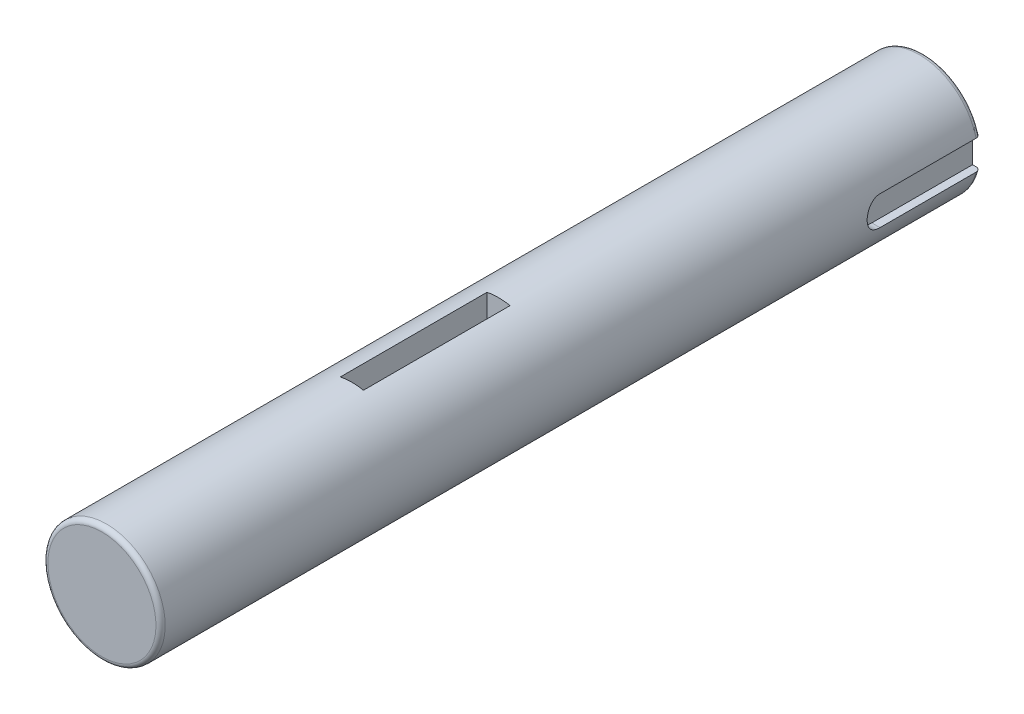
ISO-10303-21;
HEADER;
FILE_DESCRIPTION(('STEP AP214'),'2;1');
FILE_NAME('part.step','',(''),(''),'','','');
FILE_SCHEMA(('AUTOMOTIVE_DESIGN { 1 0 10303 214 1 1 1 1 }'));
ENDSEC;
DATA;
#1=APPLICATION_CONTEXT('core data for automotive mechanical design processes');
#2=APPLICATION_PROTOCOL_DEFINITION('international standard','automotive_design',2000,#1);
#3=PRODUCT_CONTEXT('',#1,'mechanical');
#4=PRODUCT('Part','Part','',(#3));
#5=PRODUCT_RELATED_PRODUCT_CATEGORY('part','',(#4));
#6=PRODUCT_DEFINITION_FORMATION('','',#4);
#7=PRODUCT_DEFINITION_CONTEXT('part definition',#1,'design');
#8=PRODUCT_DEFINITION('design','',#6,#7);
#9=PRODUCT_DEFINITION_SHAPE('','',#8);
#10=(LENGTH_UNIT() NAMED_UNIT(*) SI_UNIT(.MILLI.,.METRE.));
#11=(NAMED_UNIT(*) PLANE_ANGLE_UNIT() SI_UNIT($,.RADIAN.));
#12=(NAMED_UNIT(*) SI_UNIT($,.STERADIAN.) SOLID_ANGLE_UNIT());
#13=UNCERTAINTY_MEASURE_WITH_UNIT(LENGTH_MEASURE(1.E-05),#10,'distance_accuracy_value','');
#14=(GEOMETRIC_REPRESENTATION_CONTEXT(3) GLOBAL_UNCERTAINTY_ASSIGNED_CONTEXT((#13)) GLOBAL_UNIT_ASSIGNED_CONTEXT((#10,
#11,#12)) REPRESENTATION_CONTEXT('',''));
#15=CARTESIAN_POINT('',(0.,0.,0.));
#16=DIRECTION('',(0.,0.,1.));
#17=DIRECTION('',(1.,0.,0.));
#18=AXIS2_PLACEMENT_3D('',#15,#16,#17);
#19=CARTESIAN_POINT('',(0.,0.,0.));
#20=DIRECTION('',(0.,0.,-1.));
#21=DIRECTION('',(0.,1.,0.));
#22=AXIS2_PLACEMENT_3D('',#19,#20,#21);
#23=PLANE('',#22);
#24=DIRECTION('',(1.,0.,0.));
#25=VECTOR('',#24,1.);
#26=CARTESIAN_POINT('',(21.05,-6.35,0.));
#27=LINE('',#26,#25);
#28=CARTESIAN_POINT('',(21.05,-6.35,0.));
#29=VERTEX_POINT('',#28);
#30=CARTESIAN_POINT('',(22.5219337535846,-6.35,0.));
#31=VERTEX_POINT('',#30);
#32=EDGE_CURVE('E149',#29,#31,#27,.T.);
#33=ORIENTED_EDGE('',*,*,#32,.T.);
#34=CARTESIAN_POINT('',(0.,0.,0.));
#35=DIRECTION('',(0.,0.,-1.));
#36=DIRECTION('',(0.,1.,0.));
#37=AXIS2_PLACEMENT_3D('',#34,#35,#36);
#38=CIRCLE('',#37,23.4);
#39=CARTESIAN_POINT('',(22.5219337535657,6.35,0.));
#40=VERTEX_POINT('',#39);
#41=EDGE_CURVE('E195',#31,#40,#38,.T.);
#42=ORIENTED_EDGE('',*,*,#41,.T.);
#43=DIRECTION('',(1.,0.,0.));
#44=VECTOR('',#43,1.);
#45=CARTESIAN_POINT('',(21.05,6.35,0.));
#46=LINE('',#45,#44);
#47=CARTESIAN_POINT('',(21.05,6.35,0.));
#48=VERTEX_POINT('',#47);
#49=EDGE_CURVE('E148',#48,#40,#46,.T.);
#50=ORIENTED_EDGE('',*,*,#49,.F.);
#51=DIRECTION('',(0.,1.,0.));
#52=VECTOR('',#51,1.);
#53=CARTESIAN_POINT('',(21.05,6.35,0.));
#54=LINE('',#53,#52);
#55=EDGE_CURVE('E135',#29,#48,#54,.T.);
#56=ORIENTED_EDGE('',*,*,#55,.F.);
#57=EDGE_LOOP('',(#33,#42,#50,#56));
#58=FACE_BOUND('',#57,.T.);
#59=ADVANCED_FACE('F34',(#58),#23,.T.);
#60=CARTESIAN_POINT('',(0.,0.,2.));
#61=DIRECTION('',(0.,0.,-1.));
#62=DIRECTION('',(0.,1.,0.));
#63=AXIS2_PLACEMENT_3D('',#60,#61,#62);
#64=TOROIDAL_SURFACE('',#63,23.4000000000001,2.);
#65=CARTESIAN_POINT('',(21.4660827730526,-6.35,0.276341628928589));
#66=CARTESIAN_POINT('',(21.3657190871375,-6.35,0.332985201502739));
#67=CARTESIAN_POINT('',(21.2699361555777,-6.35,0.397883089300217));
#68=CARTESIAN_POINT('',(21.0903923768844,-6.35,0.542726515744946));
#69=CARTESIAN_POINT('',(21.0066419857732,-6.35,0.622685003979037));
#70=CARTESIAN_POINT('',(20.853793271713,-6.35,0.795793697997615));
#71=CARTESIAN_POINT('',(20.7847151116909,-6.35,0.88896176743119));
#72=CARTESIAN_POINT('',(20.6638075830707,-6.35,1.08587586156095));
#73=CARTESIAN_POINT('',(20.6119723312019,-6.35,1.18961826248516));
#74=CARTESIAN_POINT('',(20.528833603456,-6.35,1.40124195470699));
#75=CARTESIAN_POINT('',(20.4969317895799,-6.35,1.50888806094866));
#76=CARTESIAN_POINT('',(20.4523384870174,-6.35,1.72808700588808));
#77=CARTESIAN_POINT('',(20.4396434577715,-6.35,1.83963912067606));
#78=CARTESIAN_POINT('',(20.4340467022498,-6.35,2.05958465654632));
#79=CARTESIAN_POINT('',(20.4405132416019,-6.35,2.16796250562678));
#80=CARTESIAN_POINT('',(20.471636046302,-6.35,2.38206446982306));
#81=CARTESIAN_POINT('',(20.4962912345292,-6.35,2.48778874169876));
#82=CARTESIAN_POINT('',(20.5627674762637,-6.35,2.69322349061848));
#83=CARTESIAN_POINT('',(20.6045214542427,-6.35,2.79295573972768));
#84=CARTESIAN_POINT('',(20.7037679935274,-6.35,2.9842434446737));
#85=CARTESIAN_POINT('',(20.7612621468403,-6.35,3.07579807215912));
#86=CARTESIAN_POINT('',(20.8918551491658,-6.35,3.2507533346549));
#87=CARTESIAN_POINT('',(20.9653217124337,-6.35,3.33387919562343));
#88=CARTESIAN_POINT('',(21.1246651736042,-6.35,3.4872256859756));
#89=CARTESIAN_POINT('',(21.2105444564782,-6.35,3.55744382937561));
#90=CARTESIAN_POINT('',(21.3960796054276,-6.35,3.68606606290128));
#91=CARTESIAN_POINT('',(21.4961593677836,-6.35,3.74385874109108));
#92=CARTESIAN_POINT('',(21.7043407983787,-6.35,3.84251532850828));
#93=CARTESIAN_POINT('',(21.8124440530085,-6.35,3.88337587937568));
#94=CARTESIAN_POINT('',(22.0378762132366,-6.35,3.94846500203193));
#95=CARTESIAN_POINT('',(22.1553982344222,-6.35,3.97202603671922));
#96=CARTESIAN_POINT('',(22.3927256337619,-6.35,3.99943749694812));
#97=CARTESIAN_POINT('',(22.5125312892844,-6.35,4.00328551265335));
#98=CARTESIAN_POINT('',(22.7530756122925,-6.35,3.99101534652746));
#99=CARTESIAN_POINT('',(22.8737979805774,-6.35,3.9745728919217));
#100=CARTESIAN_POINT('',(23.1107202385136,-6.35,3.92146328757417));
#101=CARTESIAN_POINT('',(23.2269201913182,-6.35,3.88479642036484));
#102=CARTESIAN_POINT('',(23.4502431062685,-6.35,3.7924858577057));
#103=CARTESIAN_POINT('',(23.5574417721367,-6.35,3.73702563491983));
#104=CARTESIAN_POINT('',(23.760635685377,-6.35,3.60839019596958));
#105=CARTESIAN_POINT('',(23.8566325682802,-6.35,3.53521757073644));
#106=CARTESIAN_POINT('',(24.0317131401887,-6.35,3.37542153623586));
#107=CARTESIAN_POINT('',(24.1112012033014,-6.35,3.28924140419281));
#108=CARTESIAN_POINT('',(24.2539640930054,-6.35,3.10435605683604));
#109=CARTESIAN_POINT('',(24.3172422144524,-6.35,3.00565339297851));
#110=CARTESIAN_POINT('',(24.4235345261517,-6.35,2.80214186835381));
#111=CARTESIAN_POINT('',(24.4671637874498,-6.35,2.69765411408891));
#112=CARTESIAN_POINT('',(24.5357355230922,-6.35,2.48271790604074));
#113=CARTESIAN_POINT('',(24.5606811154363,-6.35,2.37227045013412));
#114=CARTESIAN_POINT('',(24.5906245926256,-6.35,2.15159794820088));
#115=CARTESIAN_POINT('',(24.5961177176307,-6.35,2.04143986139854));
#116=CARTESIAN_POINT('',(24.5883551814952,-6.35,1.82179157216518));
#117=CARTESIAN_POINT('',(24.5751009433796,-6.35,1.71230131967553));
#118=CARTESIAN_POINT('',(24.5304863344191,-6.35,1.49806036403073));
#119=CARTESIAN_POINT('',(24.4992814854266,-6.35,1.39327718156559));
#120=CARTESIAN_POINT('',(24.419904771508,-6.35,1.1903557558015));
#121=CARTESIAN_POINT('',(24.3717324212458,-6.35,1.09221770267466));
#122=CARTESIAN_POINT('',(24.2593350082909,-6.35,0.90418193614259));
#123=CARTESIAN_POINT('',(24.1949428637423,-6.35,0.814384204068524));
#124=CARTESIAN_POINT('',(24.052353013183,-6.35,0.646525804250856));
#125=CARTESIAN_POINT('',(23.974153735134,-6.35,0.568466474882173));
#126=CARTESIAN_POINT('',(23.8040191628536,-6.35,0.424074891899811));
#127=CARTESIAN_POINT('',(23.7117773387769,-6.35,0.358104004852536));
#128=CARTESIAN_POINT('',(23.5178206959817,-6.35,0.242006831078214));
#129=CARTESIAN_POINT('',(23.4161047302198,-6.35,0.191882466141398));
#130=CARTESIAN_POINT('',(23.2024971806971,-6.35,0.107157512275249));
#131=CARTESIAN_POINT('',(23.0903804318179,-6.35,0.0731245471800341));
#132=CARTESIAN_POINT('',(22.8620700239232,-6.35,0.0237801020119275));
#133=CARTESIAN_POINT('',(22.7458747714312,-6.35,0.00847602500880295));
#134=CARTESIAN_POINT('',(22.5091883099231,-6.35,-0.00330736512227577));
#135=CARTESIAN_POINT('',(22.3886695837694,-6.35,0.000766761527939125));
#136=CARTESIAN_POINT('',(22.1500664063449,-6.35,0.0288643264058206));
#137=CARTESIAN_POINT('',(22.0319796313091,-6.35,0.0528677201493369));
#138=CARTESIAN_POINT('',(21.8383483299907,-6.35,0.109414371901366));
#139=CARTESIAN_POINT('',(21.7612548210788,-6.35,0.136786902411852));
#140=CARTESIAN_POINT('',(21.6107009268289,-6.35,0.200170433898773));
#141=CARTESIAN_POINT('',(21.5372405241582,-6.35,0.236181393658159));
#142=CARTESIAN_POINT('',(21.4660827730526,-6.35,0.276341628928589));
#143=B_SPLINE_CURVE_WITH_KNOTS('',3,(#65,#66,#67,#68,#69,#70,#71,#72,#73,#74,#75,#76,#77,#78,
#79,#80,#81,#82,#83,#84,#85,#86,#87,#88,#89,#90,#91,#92,#93,#94,#95,#96,#97,#98,#99,#100,#101,
#102,#103,#104,#105,#106,#107,#108,#109,#110,#111,#112,#113,#114,#115,#116,#117,#118,#119,#120,
#121,#122,#123,#124,#125,#126,#127,#128,#129,#130,#131,#132,#133,#134,#135,#136,#137,#138,#139,
#140,#141,#142),.UNSPECIFIED.,.T.,.F.,(4,2,2,2,2,2,2,2,2,2,2,2,2,2,2,2,2,2,2,2,2,2,2,2,2,2,2,2,
2,2,2,2,2,2,2,2,2,2,4),(0.,0.345451613804507,0.691201625234868,1.03742374361034,
1.38352760973308,1.71866862397346,2.05374785112197,2.37790412329771,2.70204120067869,
3.02491874378853,3.34782895574487,3.67915680802435,4.01054840624442,4.35569642843138,
4.70091287540151,5.05883584127049,5.41680256072195,5.78056496465215,6.14432228699731,
6.50462606680503,6.86487717398441,7.2148509976872,7.56475362866626,7.90277607694787,
8.24074210221678,8.57003941246915,8.89931172864002,9.22577333759667,9.55224428537423,
9.88222658104576,10.2122464717575,10.5509240261556,10.8896426380019,11.2395525205681,
11.5896006692953,11.9497052062088,12.3094479948424,12.5543740058358,12.7992988482224),.UNSPECIFIED.);
#144=CARTESIAN_POINT('',(24.5934442484171,-6.35,2.));
#145=VERTEX_POINT('',#144);
#146=EDGE_CURVE('E163',#145,#31,#143,.T.);
#147=ORIENTED_EDGE('',*,*,#146,.F.);
#148=CARTESIAN_POINT('',(0.,0.,2.));
#149=DIRECTION('',(0.,0.,-1.));
#150=DIRECTION('',(0.,1.,0.));
#151=AXIS2_PLACEMENT_3D('',#148,#149,#150);
#152=CIRCLE('',#151,25.4000000000001);
#153=CARTESIAN_POINT('',(24.5934442484172,6.35,2.));
#154=VERTEX_POINT('',#153);
#155=EDGE_CURVE('E205',#145,#154,#152,.T.);
#156=ORIENTED_EDGE('',*,*,#155,.T.);
#157=CARTESIAN_POINT('',(21.4660827730526,6.35,0.276341628928589));
#158=CARTESIAN_POINT('',(21.5710842555623,6.35,0.217091085900893));
#159=CARTESIAN_POINT('',(21.6812560128715,6.35,0.166789983188979));
#160=CARTESIAN_POINT('',(21.908597867135,6.35,0.0853669639085896));
#161=CARTESIAN_POINT('',(22.0257789034783,6.35,0.0542759329057522));
#162=CARTESIAN_POINT('',(22.2635733646172,6.35,0.0121137284896716));
#163=CARTESIAN_POINT('',(22.3841830757241,6.35,0.00102167436584336));
#164=CARTESIAN_POINT('',(22.6255222272109,6.35,-0.000886540404961683));
#165=CARTESIAN_POINT('',(22.7462516146839,6.35,0.00829058251994164));
#166=CARTESIAN_POINT('',(22.9851606106335,6.35,0.0468889799237799));
#167=CARTESIAN_POINT('',(23.1033214384654,6.35,0.0764270077282673));
#168=CARTESIAN_POINT('',(23.3328793391199,6.35,0.155258982537404));
#169=CARTESIAN_POINT('',(23.4442763774859,6.35,0.204553030175012));
#170=CARTESIAN_POINT('',(23.6550451049705,6.35,0.320737310643597));
#171=CARTESIAN_POINT('',(23.7545879858434,6.35,0.387316603142431));
#172=CARTESIAN_POINT('',(23.9406051001662,6.35,0.53675478409388));
#173=CARTESIAN_POINT('',(24.0270816941892,6.35,0.619610725748738));
#174=CARTESIAN_POINT('',(24.1815321681423,6.35,0.796433755330171));
#175=CARTESIAN_POINT('',(24.250008354211,6.35,0.889961995513799));
#176=CARTESIAN_POINT('',(24.3696599911094,6.35,1.08750062657604));
#177=CARTESIAN_POINT('',(24.4208389444711,6.35,1.19150888980164));
#178=CARTESIAN_POINT('',(24.5027366157631,6.35,1.40339124441844));
#179=CARTESIAN_POINT('',(24.5340680296882,6.35,1.51102872221333));
#180=CARTESIAN_POINT('',(24.5777855259891,6.35,1.73008224728945));
#181=CARTESIAN_POINT('',(24.5901742578679,6.35,1.84149776390961));
#182=CARTESIAN_POINT('',(24.5955241316361,6.35,2.06246864559837));
#183=CARTESIAN_POINT('',(24.5888834406565,6.35,2.172014582079));
#184=CARTESIAN_POINT('',(24.5572547830059,6.35,2.388418610064));
#185=CARTESIAN_POINT('',(24.5322675832755,6.35,2.49527681373075));
#186=CARTESIAN_POINT('',(24.4648499201159,6.35,2.70306701386404));
#187=CARTESIAN_POINT('',(24.4224584081901,6.35,2.80401167226216));
#188=CARTESIAN_POINT('',(24.321593898498,6.35,2.99750935318419));
#189=CARTESIAN_POINT('',(24.2631199750951,6.35,3.09006189228492));
#190=CARTESIAN_POINT('',(24.1308051899835,6.35,3.26583290025107));
#191=CARTESIAN_POINT('',(24.0567277021389,6.35,3.34887308876995));
#192=CARTESIAN_POINT('',(23.8960428780766,6.35,3.50177525540593));
#193=CARTESIAN_POINT('',(23.8094339036878,6.35,3.57163550782864));
#194=CARTESIAN_POINT('',(23.6234334600127,6.35,3.69842243819878));
#195=CARTESIAN_POINT('',(23.5237397036543,6.35,3.75490550032186));
#196=CARTESIAN_POINT('',(23.3165123083763,6.35,3.85094635649154));
#197=CARTESIAN_POINT('',(23.2089773663779,6.35,3.89050132982525));
#198=CARTESIAN_POINT('',(22.9853320066497,6.35,3.9528965326283));
#199=CARTESIAN_POINT('',(22.8690557568413,6.35,3.97514279214383));
#200=CARTESIAN_POINT('',(22.6344271548724,6.35,4.00030237006931));
#201=CARTESIAN_POINT('',(22.5160744892845,6.35,4.00321274418253));
#202=CARTESIAN_POINT('',(22.2776469246073,6.35,3.98953892943707));
#203=CARTESIAN_POINT('',(22.1575986269632,6.35,3.97248636771173));
#204=CARTESIAN_POINT('',(21.9220332639296,6.35,3.9185419560001));
#205=CARTESIAN_POINT('',(21.806516519029,6.35,3.88164870550791));
#206=CARTESIAN_POINT('',(21.5830228088632,6.35,3.78875053476855));
#207=CARTESIAN_POINT('',(21.4750691275931,6.35,3.73268947260229));
#208=CARTESIAN_POINT('',(21.2704010991088,6.35,3.60282621644632));
#209=CARTESIAN_POINT('',(21.1736856921885,6.35,3.52902569720499));
#210=CARTESIAN_POINT('',(20.9968082572405,6.35,3.36749998174988));
#211=CARTESIAN_POINT('',(20.916310669014,6.35,3.28014272380628));
#212=CARTESIAN_POINT('',(20.7718957832662,6.35,3.09264757938249));
#213=CARTESIAN_POINT('',(20.7079742068274,6.35,2.99251300120709));
#214=CARTESIAN_POINT('',(20.601404493887,6.35,2.78679066656835));
#215=CARTESIAN_POINT('',(20.5579790378762,6.35,2.68160561777895));
#216=CARTESIAN_POINT('',(20.4902085815663,6.35,2.46526046068839));
#217=CARTESIAN_POINT('',(20.4658586262028,6.35,2.35410191208984));
#218=CARTESIAN_POINT('',(20.437746011006,6.35,2.13356422429261));
#219=CARTESIAN_POINT('',(20.4332283240051,6.35,2.02428080314187));
#220=CARTESIAN_POINT('',(20.4428813957759,6.35,1.80655522952302));
#221=CARTESIAN_POINT('',(20.4570492974485,6.35,1.69811295099098));
#222=CARTESIAN_POINT('',(20.5032231424522,6.35,1.48664292377149));
#223=CARTESIAN_POINT('',(20.5349864470726,6.35,1.38356194602923));
#224=CARTESIAN_POINT('',(20.6150758320543,6.35,1.18402594911169));
#225=CARTESIAN_POINT('',(20.6634071907021,6.35,1.08757305329512));
#226=CARTESIAN_POINT('',(20.7760765725957,6.35,0.902056342525429));
#227=CARTESIAN_POINT('',(20.8406976508719,6.35,0.813164921244131));
#228=CARTESIAN_POINT('',(20.9833834989253,6.35,0.647059034693521));
#229=CARTESIAN_POINT('',(21.0614343586932,6.35,0.569832641162439));
#230=CARTESIAN_POINT('',(21.1949020403492,6.35,0.457211336764753));
#231=CARTESIAN_POINT('',(21.246751691686,6.35,0.417506951922709));
#232=CARTESIAN_POINT('',(21.3539235423421,6.35,0.343108218826143));
#233=CARTESIAN_POINT('',(21.4092457039502,6.35,0.308413816177109));
#234=CARTESIAN_POINT('',(21.4660827730526,6.35,0.276341628928589));
#235=B_SPLINE_CURVE_WITH_KNOTS('',3,(#157,#158,#159,#160,#161,#162,#163,#164,#165,#166,#167,
#168,#169,#170,#171,#172,#173,#174,#175,#176,#177,#178,#179,#180,#181,#182,#183,#184,#185,#186,
#187,#188,#189,#190,#191,#192,#193,#194,#195,#196,#197,#198,#199,#200,#201,#202,#203,#204,#205,
#206,#207,#208,#209,#210,#211,#212,#213,#214,#215,#216,#217,#218,#219,#220,#221,#222,#223,#224,
#225,#226,#227,#228,#229,#230,#231,#232,#233,#234),.UNSPECIFIED.,.T.,.F.,(4,2,2,2,2,2,2,2,2,2,2,
2,2,2,2,2,2,2,2,2,2,2,2,2,2,2,2,2,2,2,2,2,2,2,2,2,2,2,4),(0.,0.361452367061329,
0.723484367955783,1.08513815586848,1.44667212356193,1.81029663229444,2.1739229932763,
2.53141377383672,2.88883989220745,3.23486221794805,3.58081443528158,3.91548692807329,
4.2501126061136,4.5777881000128,4.90544989684565,5.23238233746238,5.55933359888498,
5.89165501789507,6.22401991873952,6.56621451055226,6.90846609977598,7.261999735967,
7.61558720388351,7.9776396462775,8.33971764842682,8.70286538195013,9.06597884484295,
9.42056014293448,9.77504981839384,10.1147268087022,10.4543155350093,10.7808571507791,
11.1073488428565,11.4294464612332,11.7516467896798,12.0798865938355,12.407788445158,
12.603443932507,12.7990972954203),.UNSPECIFIED.);
#236=EDGE_CURVE('E55',#40,#154,#235,.T.);
#237=ORIENTED_EDGE('',*,*,#236,.F.);
#238=ORIENTED_EDGE('',*,*,#41,.F.);
#239=EDGE_LOOP('',(#147,#156,#237,#238));
#240=FACE_BOUND('',#239,.T.);
#241=ADVANCED_FACE('F168',(#240),#64,.T.);
#242=CARTESIAN_POINT('',(0.,0.,0.));
#243=DIRECTION('',(0.,0.,-1.));
#244=DIRECTION('',(0.,1.,0.));
#245=AXIS2_PLACEMENT_3D('',#242,#243,#244);
#246=CYLINDRICAL_SURFACE('',#245,25.4);
#247=CARTESIAN_POINT('',(0.,0.,184.25));
#248=DIRECTION('',(0.,0.,1.));
#249=DIRECTION('',(-1.,0.,0.));
#250=AXIS2_PLACEMENT_3D('',#247,#248,#249);
#251=CIRCLE('',#250,25.4);
#252=CARTESIAN_POINT('',(5.,24.9030118660374,184.25));
#253=VERTEX_POINT('',#252);
#254=CARTESIAN_POINT('',(-5.,24.9030118660374,184.25));
#255=VERTEX_POINT('',#254);
#256=EDGE_CURVE('E115',#253,#255,#251,.T.);
#257=ORIENTED_EDGE('',*,*,#256,.F.);
#258=DIRECTION('',(0.,0.,1.));
#259=VECTOR('',#258,1.);
#260=CARTESIAN_POINT('',(5.,24.9030118660374,184.25));
#261=LINE('',#260,#259);
#262=CARTESIAN_POINT('',(5.,24.9030118660374,247.75));
#263=VERTEX_POINT('',#262);
#264=EDGE_CURVE('E139',#253,#263,#261,.T.);
#265=ORIENTED_EDGE('',*,*,#264,.T.);
#266=CARTESIAN_POINT('',(0.,0.,247.75));
#267=DIRECTION('',(0.,0.,1.));
#268=DIRECTION('',(-1.,0.,0.));
#269=AXIS2_PLACEMENT_3D('',#266,#267,#268);
#270=CIRCLE('',#269,25.4);
#271=CARTESIAN_POINT('',(-5.,24.9030118660374,247.75));
#272=VERTEX_POINT('',#271);
#273=EDGE_CURVE('E128',#263,#272,#270,.T.);
#274=ORIENTED_EDGE('',*,*,#273,.T.);
#275=DIRECTION('',(0.,0.,1.));
#276=VECTOR('',#275,1.);
#277=CARTESIAN_POINT('',(-5.,24.9030118660374,184.25));
#278=LINE('',#277,#276);
#279=EDGE_CURVE('E108',#255,#272,#278,.T.);
#280=ORIENTED_EDGE('',*,*,#279,.F.);
#281=EDGE_LOOP('',(#257,#265,#274,#280));
#282=FACE_BOUND('',#281,.T.);
#283=CARTESIAN_POINT('',(24.5934442484171,6.35,43.65));
#284=CARTESIAN_POINT('',(24.59342399561,6.35002226825438,43.8256066469149));
#285=CARTESIAN_POINT('',(24.5953244125308,6.34271649856399,44.0012062181525));
#286=CARTESIAN_POINT('',(24.6028191717352,6.31361266572557,44.3510922717065));
#287=CARTESIAN_POINT('',(24.6084128924388,6.29181704120424,44.5253789699872));
#288=CARTESIAN_POINT('',(24.6231323831977,6.23395439168836,44.8710584954985));
#289=CARTESIAN_POINT('',(24.6322511536516,6.19791564574493,45.0424563595291));
#290=CARTESIAN_POINT('',(24.6537418948008,6.11187270523622,45.3815011872312));
#291=CARTESIAN_POINT('',(24.666113910234,6.06186831861761,45.5491480992859));
#292=CARTESIAN_POINT('',(24.6937440847154,5.94831147701048,45.879481368008));
#293=CARTESIAN_POINT('',(24.7090013369516,5.88476327796289,46.0421692646582));
#294=CARTESIAN_POINT('',(24.7419701947315,5.74457094953952,46.3616122186749));
#295=CARTESIAN_POINT('',(24.7596827100916,5.66792196310165,46.5183650492165));
#296=CARTESIAN_POINT('',(24.7970552992145,5.50211464732158,46.824836264834));
#297=CARTESIAN_POINT('',(24.816715119977,5.41295794239782,46.9745555600131));
#298=CARTESIAN_POINT('',(24.8574482570743,5.22271283055597,47.2660861404662));
#299=CARTESIAN_POINT('',(24.8785221038682,5.12161993495763,47.407894421045));
#300=CARTESIAN_POINT('',(24.9219204651014,4.90613775099733,47.6853133317011));
#301=CARTESIAN_POINT('',(24.9442612822259,4.79152918432234,47.8207511345101));
#302=CARTESIAN_POINT('',(24.9891976739831,4.55136526382703,48.0815929260103));
#303=CARTESIAN_POINT('',(25.0117933400962,4.42580586268198,48.2069931717964));
#304=CARTESIAN_POINT('',(25.0566047845047,4.16462539845663,48.4468558087274));
#305=CARTESIAN_POINT('',(25.0788206394973,4.02900639701391,48.5613204301025));
#306=CARTESIAN_POINT('',(25.1222767112597,3.74851408067472,48.7786086146377));
#307=CARTESIAN_POINT('',(25.1435165655768,3.60363737477898,48.8814278735481));
#308=CARTESIAN_POINT('',(25.1847122322166,3.30356106183184,49.0759928147199));
#309=CARTESIAN_POINT('',(25.2046462706254,3.14824655790408,49.1675660321712));
#310=CARTESIAN_POINT('',(25.2423393555967,2.83018477727402,49.3372703687127));
#311=CARTESIAN_POINT('',(25.2600984041433,2.66743750735259,49.4154015000658));
#312=CARTESIAN_POINT('',(25.2929316298726,2.33567696560788,49.5575949263985));
#313=CARTESIAN_POINT('',(25.3080062588808,2.16666475405889,49.6216595893861));
#314=CARTESIAN_POINT('',(25.3350393515743,1.82356472524718,49.7352085239542));
#315=CARTESIAN_POINT('',(25.346997815649,1.64947690861847,49.784692797356));
#316=CARTESIAN_POINT('',(25.3672409387314,1.30111633926894,49.8677973609992));
#317=CARTESIAN_POINT('',(25.3755956576537,1.1269200157858,49.9017210782609));
#318=CARTESIAN_POINT('',(25.3887471133584,0.776104689447263,49.9548906053919));
#319=CARTESIAN_POINT('',(25.3935426287897,0.599484876119527,49.9741313768287));
#320=CARTESIAN_POINT('',(25.3994330798425,0.245274658168906,49.9977422547894));
#321=CARTESIAN_POINT('',(25.4005297272473,0.0676847406206133,50.0021192400671));
#322=CARTESIAN_POINT('',(25.3989956270267,-0.287283883078299,49.9959820439755));
#323=CARTESIAN_POINT('',(25.3963635920845,-0.464662495112752,49.9854627196982));
#324=CARTESIAN_POINT('',(25.3875452225296,-0.813860470059627,49.9500188607268));
#325=CARTESIAN_POINT('',(25.3814398889881,-0.985715316929292,49.9254225406324));
#326=CARTESIAN_POINT('',(25.3659026819325,-1.32669078709543,49.8622825331621));
#327=CARTESIAN_POINT('',(25.3564707891564,-1.49581139455375,49.8237387650256));
#328=CARTESIAN_POINT('',(25.3345323508879,-1.83017728100283,49.7330062895065));
#329=CARTESIAN_POINT('',(25.3220252613237,-1.99542186856521,49.6808151674954));
#330=CARTESIAN_POINT('',(25.2942753389209,-2.32083965579539,49.5632162480564));
#331=CARTESIAN_POINT('',(25.2790333687573,-2.48101443596563,49.4978126174906));
#332=CARTESIAN_POINT('',(25.2460591028223,-2.79677231378058,49.353592909505));
#333=CARTESIAN_POINT('',(25.2283048082803,-2.95229831549628,49.2746568852268));
#334=CARTESIAN_POINT('',(25.1908947406485,-3.25610863361824,49.1044081997374));
#335=CARTESIAN_POINT('',(25.1712396104952,-3.40439537326479,49.0130997192105));
#336=CARTESIAN_POINT('',(25.1305321115418,-3.69291127599972,48.8186730818548));
#337=CARTESIAN_POINT('',(25.1094790904371,-3.83313661960252,48.715549395123));
#338=CARTESIAN_POINT('',(25.0665456557678,-4.10452932627895,48.4982520621496));
#339=CARTESIAN_POINT('',(25.0446655232207,-4.23569972378649,48.3840821487514));
#340=CARTESIAN_POINT('',(25.0000441154735,-4.49167385706058,48.1421290399064));
#341=CARTESIAN_POINT('',(24.9772956573584,-4.61620524520781,48.0140588679081));
#342=CARTESIAN_POINT('',(24.9321694915878,-4.854026459788,47.747897847719));
#343=CARTESIAN_POINT('',(24.9097916560394,-4.96732023433811,47.6098105485827));
#344=CARTESIAN_POINT('',(24.8660155982506,-5.18201532101834,47.3243880208615));
#345=CARTESIAN_POINT('',(24.8446180304735,-5.28340875660053,47.1770467652276));
#346=CARTESIAN_POINT('',(24.8034409495761,-5.47346065388363,46.8742316685887));
#347=CARTESIAN_POINT('',(24.7836608132452,-5.5621240306375,46.7187609981366));
#348=CARTESIAN_POINT('',(24.7461797394811,-5.72658249910033,46.3997530695176));
#349=CARTESIAN_POINT('',(24.7284915612752,-5.80229976463773,46.2361741617088));
#350=CARTESIAN_POINT('',(24.6958708180522,-5.93960823191683,45.9029989708502));
#351=CARTESIAN_POINT('',(24.6809371537501,-6.00120507130197,45.7334051206313));
#352=CARTESIAN_POINT('',(24.6542926791668,-6.10974440950255,45.389539125231));
#353=CARTESIAN_POINT('',(24.6425785332751,-6.15670208218525,45.2152720289007));
#354=CARTESIAN_POINT('',(24.6227254507234,-6.23562713279543,44.863248555655));
#355=CARTESIAN_POINT('',(24.6145848392238,-6.2676015335399,44.6854938542035));
#356=CARTESIAN_POINT('',(24.6034175062818,-6.31128019052621,44.3646830092342));
#357=CARTESIAN_POINT('',(24.5996824867871,-6.3258044070736,44.222028557992));
#358=CARTESIAN_POINT('',(24.594693697821,-6.34516051539284,43.9362533910743));
#359=CARTESIAN_POINT('',(24.5934359139676,-6.35000808842387,43.7931338068445));
#360=CARTESIAN_POINT('',(24.5934442484171,-6.35,43.65));
#361=B_SPLINE_CURVE_WITH_KNOTS('',3,(#283,#284,#285,#286,#287,#288,#289,#290,#291,#292,#293,
#294,#295,#296,#297,#298,#299,#300,#301,#302,#303,#304,#305,#306,#307,#308,#309,#310,#311,#312,
#313,#314,#315,#316,#317,#318,#319,#320,#321,#322,#323,#324,#325,#326,#327,#328,#329,#330,#331,
#332,#333,#334,#335,#336,#337,#338,#339,#340,#341,#342,#343,#344,#345,#346,#347,#348,#349,#350,
#351,#352,#353,#354,#355,#356,#357,#358,#359,#360),.UNSPECIFIED.,.F.,.F.,(4,2,2,2,2,2,2,2,2,2,2,
2,2,2,2,2,2,2,2,2,2,2,2,2,2,2,2,2,2,2,2,2,2,2,2,2,2,2,4),(0.,0.526646967657539,1.05320532363754,
1.5787234327827,2.10424876912714,2.62960920981916,3.15516484987242,3.68065229736947,
4.20633799095139,4.74218699713236,5.27823489414434,5.8141732341988,6.35030902074097,
6.89384612301394,7.43738272943167,7.9808277643601,8.5242727314053,9.05661590954033,
9.58914167845816,10.1214209682344,10.6538840707151,11.1744107041933,11.6949403517543,
12.2155621591011,12.7360200322431,13.2613552135112,13.7865133233119,14.3119182361574,
14.8371462153456,15.3767430973362,15.9161497259285,16.4559113851192,16.9954640796263,
17.538154234647,18.0806273393531,18.6225362729188,19.1641909533871,19.5941749285131,
20.0234615356133),.UNSPECIFIED.);
#362=CARTESIAN_POINT('',(24.5934442484171,6.34999999999999,43.65));
#363=VERTEX_POINT('',#362);
#364=CARTESIAN_POINT('',(24.5934442484171,-6.35,43.65));
#365=VERTEX_POINT('',#364);
#366=EDGE_CURVE('E190',#363,#365,#361,.T.);
#367=ORIENTED_EDGE('',*,*,#366,.F.);
#368=DIRECTION('',(0.,0.,-1.));
#369=VECTOR('',#368,1.);
#370=CARTESIAN_POINT('',(24.5934442484171,6.35,0.));
#371=LINE('',#370,#369);
#372=EDGE_CURVE('E11',#154,#363,#371,.F.);
#373=ORIENTED_EDGE('',*,*,#372,.F.);
#374=ORIENTED_EDGE('',*,*,#155,.F.);
#375=DIRECTION('',(0.,0.,-1.));
#376=VECTOR('',#375,1.);
#377=CARTESIAN_POINT('',(24.5934442484171,-6.35,0.));
#378=LINE('',#377,#376);
#379=EDGE_CURVE('E41',#365,#145,#378,.T.);
#380=ORIENTED_EDGE('',*,*,#379,.F.);
#381=EDGE_LOOP('',(#367,#373,#374,#380));
#382=FACE_BOUND('',#381,.T.);
#383=CARTESIAN_POINT('',(0.,0.,354.));
#384=DIRECTION('',(0.,0.,-1.));
#385=DIRECTION('',(0.,1.,0.));
#386=AXIS2_PLACEMENT_3D('',#383,#384,#385);
#387=CIRCLE('',#386,25.4);
#388=CARTESIAN_POINT('',(0.,25.3999999999999,354.));
#389=VERTEX_POINT('',#388);
#390=EDGE_CURVE('E209',#389,#389,#387,.T.);
#391=ORIENTED_EDGE('',*,*,#390,.T.);
#392=EDGE_LOOP('',(#391));
#393=FACE_BOUND('',#392,.T.);
#394=ADVANCED_FACE('F126',(#282,#382,#393),#246,.T.);
#395=CARTESIAN_POINT('',(0.,0.,354.));
#396=DIRECTION('',(0.,0.,-1.));
#397=DIRECTION('',(0.,1.,0.));
#398=AXIS2_PLACEMENT_3D('',#395,#396,#397);
#399=TOROIDAL_SURFACE('',#398,23.4,2.);
#400=CARTESIAN_POINT('',(0.,0.,356.));
#401=DIRECTION('',(0.,0.,-1.));
#402=DIRECTION('',(0.,1.,0.));
#403=AXIS2_PLACEMENT_3D('',#400,#401,#402);
#404=CIRCLE('',#403,23.4);
#405=CARTESIAN_POINT('',(0.,23.3999999999999,356.));
#406=VERTEX_POINT('',#405);
#407=EDGE_CURVE('E207',#406,#406,#404,.T.);
#408=ORIENTED_EDGE('',*,*,#407,.T.);
#409=EDGE_LOOP('',(#408));
#410=FACE_BOUND('',#409,.T.);
#411=ORIENTED_EDGE('',*,*,#390,.F.);
#412=EDGE_LOOP('',(#411));
#413=FACE_BOUND('',#412,.T.);
#414=ADVANCED_FACE('F183',(#410,#413),#399,.T.);
#415=CARTESIAN_POINT('',(0.,23.3999999999999,356.));
#416=DIRECTION('',(0.,0.,1.));
#417=DIRECTION('',(0.,-1.,0.));
#418=AXIS2_PLACEMENT_3D('',#415,#416,#417);
#419=PLANE('',#418);
#420=ORIENTED_EDGE('',*,*,#407,.F.);
#421=EDGE_LOOP('',(#420));
#422=FACE_BOUND('',#421,.T.);
#423=ADVANCED_FACE('F179',(#422),#419,.T.);
#424=CARTESIAN_POINT('',(21.05,-6.35,0.));
#425=DIRECTION('',(0.,-1.,0.));
#426=DIRECTION('',(0.,0.,-1.));
#427=AXIS2_PLACEMENT_3D('',#424,#425,#426);
#428=PLANE('',#427);
#429=ORIENTED_EDGE('',*,*,#146,.T.);
#430=ORIENTED_EDGE('',*,*,#32,.F.);
#431=DIRECTION('',(0.,0.,-1.));
#432=VECTOR('',#431,1.);
#433=CARTESIAN_POINT('',(21.05,-6.35,0.));
#434=LINE('',#433,#432);
#435=CARTESIAN_POINT('',(21.05,-6.35,43.65));
#436=VERTEX_POINT('',#435);
#437=EDGE_CURVE('E145',#436,#29,#434,.T.);
#438=ORIENTED_EDGE('',*,*,#437,.F.);
#439=DIRECTION('',(1.,0.,0.));
#440=VECTOR('',#439,1.);
#441=CARTESIAN_POINT('',(21.05,-6.35,43.65));
#442=LINE('',#441,#440);
#443=EDGE_CURVE('E152',#436,#365,#442,.T.);
#444=ORIENTED_EDGE('',*,*,#443,.T.);
#445=ORIENTED_EDGE('',*,*,#379,.T.);
#446=EDGE_LOOP('',(#429,#430,#438,#444,#445));
#447=FACE_BOUND('',#446,.T.);
#448=ADVANCED_FACE('F182',(#447),#428,.F.);
#449=CARTESIAN_POINT('',(21.05,0.,43.65));
#450=DIRECTION('',(1.,0.,0.));
#451=DIRECTION('',(0.,0.,-1.));
#452=AXIS2_PLACEMENT_3D('',#449,#450,#451);
#453=CYLINDRICAL_SURFACE('',#452,6.35);
#454=DIRECTION('',(1.,0.,0.));
#455=VECTOR('',#454,1.);
#456=CARTESIAN_POINT('',(21.05,6.34999999999999,43.65));
#457=LINE('',#456,#455);
#458=CARTESIAN_POINT('',(21.05,6.34999999999999,43.65));
#459=VERTEX_POINT('',#458);
#460=EDGE_CURVE('E155',#459,#363,#457,.T.);
#461=ORIENTED_EDGE('',*,*,#460,.T.);
#462=ORIENTED_EDGE('',*,*,#366,.T.);
#463=ORIENTED_EDGE('',*,*,#443,.F.);
#464=CARTESIAN_POINT('',(21.05,0.,43.65));
#465=DIRECTION('',(1.,0.,0.));
#466=DIRECTION('',(0.,0.,1.));
#467=AXIS2_PLACEMENT_3D('',#464,#465,#466);
#468=CIRCLE('',#467,6.35);
#469=EDGE_CURVE('E142',#459,#436,#468,.T.);
#470=ORIENTED_EDGE('',*,*,#469,.F.);
#471=EDGE_LOOP('',(#461,#462,#463,#470));
#472=FACE_BOUND('',#471,.T.);
#473=ADVANCED_FACE('F177',(#472),#453,.F.);
#474=CARTESIAN_POINT('',(21.05,6.35,0.));
#475=DIRECTION('',(0.,1.,0.));
#476=DIRECTION('',(0.,0.,1.));
#477=AXIS2_PLACEMENT_3D('',#474,#475,#476);
#478=PLANE('',#477);
#479=ORIENTED_EDGE('',*,*,#236,.T.);
#480=ORIENTED_EDGE('',*,*,#372,.T.);
#481=ORIENTED_EDGE('',*,*,#460,.F.);
#482=DIRECTION('',(0.,0.,1.));
#483=VECTOR('',#482,1.);
#484=CARTESIAN_POINT('',(21.05,6.35,0.));
#485=LINE('',#484,#483);
#486=EDGE_CURVE('E138',#48,#459,#485,.T.);
#487=ORIENTED_EDGE('',*,*,#486,.F.);
#488=ORIENTED_EDGE('',*,*,#49,.T.);
#489=EDGE_LOOP('',(#479,#480,#481,#487,#488));
#490=FACE_BOUND('',#489,.T.);
#491=ADVANCED_FACE('F171',(#490),#478,.F.);
#492=CARTESIAN_POINT('',(21.05,0.,43.65));
#493=DIRECTION('',(-1.,0.,0.));
#494=DIRECTION('',(0.,0.,1.));
#495=AXIS2_PLACEMENT_3D('',#492,#493,#494);
#496=PLANE('',#495);
#497=ORIENTED_EDGE('',*,*,#55,.T.);
#498=ORIENTED_EDGE('',*,*,#486,.T.);
#499=ORIENTED_EDGE('',*,*,#469,.T.);
#500=ORIENTED_EDGE('',*,*,#437,.T.);
#501=EDGE_LOOP('',(#497,#498,#499,#500));
#502=FACE_BOUND('',#501,.T.);
#503=ADVANCED_FACE('F176',(#502),#496,.F.);
#504=CARTESIAN_POINT('',(5.,24.9030118660374,184.25));
#505=DIRECTION('',(1.,0.,0.));
#506=DIRECTION('',(0.,1.,0.));
#507=AXIS2_PLACEMENT_3D('',#504,#505,#506);
#508=PLANE('',#507);
#509=DIRECTION('',(0.,1.,0.));
#510=VECTOR('',#509,1.);
#511=CARTESIAN_POINT('',(5.,24.9030118660374,247.75));
#512=LINE('',#511,#510);
#513=CARTESIAN_POINT('',(5.,14.9030118660374,247.75));
#514=VERTEX_POINT('',#513);
#515=EDGE_CURVE('E124',#514,#263,#512,.T.);
#516=ORIENTED_EDGE('',*,*,#515,.T.);
#517=ORIENTED_EDGE('',*,*,#264,.F.);
#518=DIRECTION('',(0.,1.,0.));
#519=VECTOR('',#518,1.);
#520=CARTESIAN_POINT('',(5.,24.9030118660374,184.25));
#521=LINE('',#520,#519);
#522=CARTESIAN_POINT('',(5.,14.9030118660374,184.25));
#523=VERTEX_POINT('',#522);
#524=EDGE_CURVE('E121',#523,#253,#521,.T.);
#525=ORIENTED_EDGE('',*,*,#524,.F.);
#526=DIRECTION('',(0.,0.,1.));
#527=VECTOR('',#526,1.);
#528=CARTESIAN_POINT('',(5.,14.9030118660374,184.25));
#529=LINE('',#528,#527);
#530=EDGE_CURVE('E130',#523,#514,#529,.T.);
#531=ORIENTED_EDGE('',*,*,#530,.T.);
#532=EDGE_LOOP('',(#516,#517,#525,#531));
#533=FACE_BOUND('',#532,.T.);
#534=ADVANCED_FACE('F267',(#533),#508,.F.);
#535=CARTESIAN_POINT('',(-5.,14.9030118660374,184.25));
#536=DIRECTION('',(0.,-1.,0.));
#537=DIRECTION('',(0.,0.,-1.));
#538=AXIS2_PLACEMENT_3D('',#535,#536,#537);
#539=PLANE('',#538);
#540=DIRECTION('',(1.,0.,0.));
#541=VECTOR('',#540,1.);
#542=CARTESIAN_POINT('',(-5.,14.9030118660374,247.75));
#543=LINE('',#542,#541);
#544=CARTESIAN_POINT('',(-5.,14.9030118660374,247.75));
#545=VERTEX_POINT('',#544);
#546=EDGE_CURVE('E320',#545,#514,#543,.T.);
#547=ORIENTED_EDGE('',*,*,#546,.T.);
#548=ORIENTED_EDGE('',*,*,#530,.F.);
#549=DIRECTION('',(1.,0.,0.));
#550=VECTOR('',#549,1.);
#551=CARTESIAN_POINT('',(-5.,14.9030118660374,184.25));
#552=LINE('',#551,#550);
#553=CARTESIAN_POINT('',(-5.,14.9030118660374,184.25));
#554=VERTEX_POINT('',#553);
#555=EDGE_CURVE('E114',#554,#523,#552,.T.);
#556=ORIENTED_EDGE('',*,*,#555,.F.);
#557=DIRECTION('',(0.,0.,1.));
#558=VECTOR('',#557,1.);
#559=CARTESIAN_POINT('',(-5.,14.9030118660374,184.25));
#560=LINE('',#559,#558);
#561=EDGE_CURVE('E110',#554,#545,#560,.T.);
#562=ORIENTED_EDGE('',*,*,#561,.T.);
#563=EDGE_LOOP('',(#547,#548,#556,#562));
#564=FACE_BOUND('',#563,.T.);
#565=ADVANCED_FACE('F276',(#564),#539,.F.);
#566=CARTESIAN_POINT('',(-5.,24.9030118660374,184.25));
#567=DIRECTION('',(-1.,0.,0.));
#568=DIRECTION('',(0.,-1.,0.));
#569=AXIS2_PLACEMENT_3D('',#566,#567,#568);
#570=PLANE('',#569);
#571=DIRECTION('',(0.,-1.,0.));
#572=VECTOR('',#571,1.);
#573=CARTESIAN_POINT('',(-5.,24.9030118660374,247.75));
#574=LINE('',#573,#572);
#575=EDGE_CURVE('E48',#272,#545,#574,.T.);
#576=ORIENTED_EDGE('',*,*,#575,.T.);
#577=ORIENTED_EDGE('',*,*,#561,.F.);
#578=DIRECTION('',(0.,-1.,0.));
#579=VECTOR('',#578,1.);
#580=CARTESIAN_POINT('',(-5.,24.9030118660374,184.25));
#581=LINE('',#580,#579);
#582=EDGE_CURVE('E104',#255,#554,#581,.T.);
#583=ORIENTED_EDGE('',*,*,#582,.F.);
#584=ORIENTED_EDGE('',*,*,#279,.T.);
#585=EDGE_LOOP('',(#576,#577,#583,#584));
#586=FACE_BOUND('',#585,.T.);
#587=ADVANCED_FACE('F106',(#586),#570,.F.);
#588=CARTESIAN_POINT('',(0.,0.,184.25));
#589=DIRECTION('',(0.,0.,-1.));
#590=DIRECTION('',(-1.,0.,0.));
#591=AXIS2_PLACEMENT_3D('',#588,#589,#590);
#592=PLANE('',#591);
#593=ORIENTED_EDGE('',*,*,#256,.T.);
#594=ORIENTED_EDGE('',*,*,#582,.T.);
#595=ORIENTED_EDGE('',*,*,#555,.T.);
#596=ORIENTED_EDGE('',*,*,#524,.T.);
#597=EDGE_LOOP('',(#593,#594,#595,#596));
#598=FACE_BOUND('',#597,.T.);
#599=ADVANCED_FACE('F119',(#598),#592,.F.);
#600=CARTESIAN_POINT('',(0.,0.,247.75));
#601=DIRECTION('',(0.,0.,-1.));
#602=DIRECTION('',(-1.,0.,0.));
#603=AXIS2_PLACEMENT_3D('',#600,#601,#602);
#604=PLANE('',#603);
#605=ORIENTED_EDGE('',*,*,#273,.F.);
#606=ORIENTED_EDGE('',*,*,#515,.F.);
#607=ORIENTED_EDGE('',*,*,#546,.F.);
#608=ORIENTED_EDGE('',*,*,#575,.F.);
#609=EDGE_LOOP('',(#605,#606,#607,#608));
#610=FACE_BOUND('',#609,.T.);
#611=ADVANCED_FACE('F303',(#610),#604,.T.);
#612=CLOSED_SHELL('',(#59,#241,#394,#414,#423,#448,#473,#491,#503,#534,#565,#587,#599,#611));
#613=MANIFOLD_SOLID_BREP('B2',#612);
#614=ADVANCED_BREP_SHAPE_REPRESENTATION('',(#18,#613),#14);
#615=SHAPE_DEFINITION_REPRESENTATION(#9,#614);
ENDSEC;
END-ISO-10303-21;
